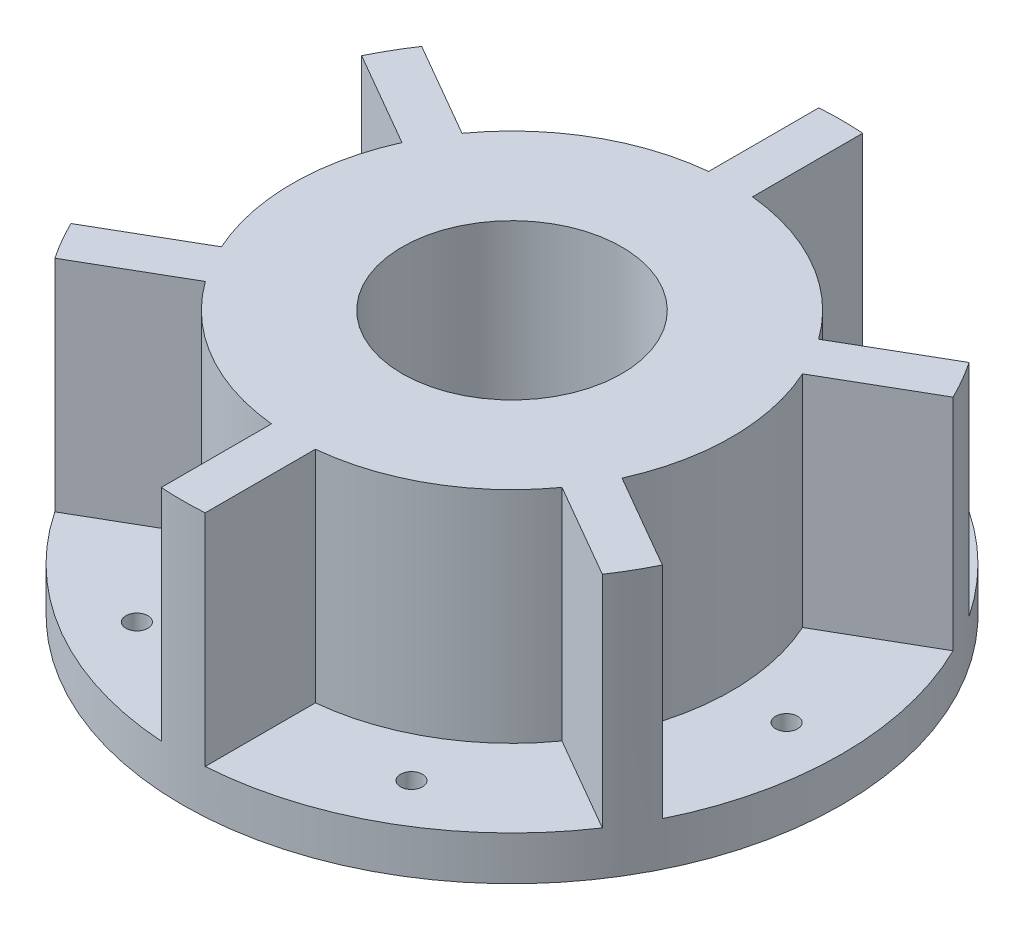
ISO-10303-21;
HEADER;
FILE_DESCRIPTION(('STEP AP214'),'2;1');
FILE_NAME('part.step','',(''),(''),'','','');
FILE_SCHEMA(('AUTOMOTIVE_DESIGN { 1 0 10303 214 1 1 1 1 }'));
ENDSEC;
DATA;
#1=APPLICATION_CONTEXT('core data for automotive mechanical design processes');
#2=APPLICATION_PROTOCOL_DEFINITION('international standard','automotive_design',2000,#1);
#3=PRODUCT_CONTEXT('',#1,'mechanical');
#4=PRODUCT('Part','Part','',(#3));
#5=PRODUCT_RELATED_PRODUCT_CATEGORY('part','',(#4));
#6=PRODUCT_DEFINITION_FORMATION('','',#4);
#7=PRODUCT_DEFINITION_CONTEXT('part definition',#1,'design');
#8=PRODUCT_DEFINITION('design','',#6,#7);
#9=PRODUCT_DEFINITION_SHAPE('','',#8);
#10=(LENGTH_UNIT() NAMED_UNIT(*) SI_UNIT(.MILLI.,.METRE.));
#11=(NAMED_UNIT(*) PLANE_ANGLE_UNIT() SI_UNIT($,.RADIAN.));
#12=(NAMED_UNIT(*) SI_UNIT($,.STERADIAN.) SOLID_ANGLE_UNIT());
#13=UNCERTAINTY_MEASURE_WITH_UNIT(LENGTH_MEASURE(1.E-05),#10,'distance_accuracy_value','');
#14=(GEOMETRIC_REPRESENTATION_CONTEXT(3) GLOBAL_UNCERTAINTY_ASSIGNED_CONTEXT((#13)) GLOBAL_UNIT_ASSIGNED_CONTEXT((#10,
#11,#12)) REPRESENTATION_CONTEXT('',''));
#15=CARTESIAN_POINT('',(0.,0.,0.));
#16=DIRECTION('',(0.,0.,1.));
#17=DIRECTION('',(1.,0.,0.));
#18=AXIS2_PLACEMENT_3D('',#15,#16,#17);
#19=CARTESIAN_POINT('',(0.,10.,0.));
#20=DIRECTION('',(0.,1.,0.));
#21=DIRECTION('',(0.,0.,1.));
#22=AXIS2_PLACEMENT_3D('',#19,#20,#21);
#23=PLANE('',#22);
#24=CARTESIAN_POINT('',(31.2500000000003,10.,54.1265877365273));
#25=DIRECTION('',(0.,1.,0.));
#26=DIRECTION('',(0.866025403784436,0.,-0.500000000000004));
#27=AXIS2_PLACEMENT_3D('',#24,#25,#26);
#28=CIRCLE('',#27,2.5);
#29=CARTESIAN_POINT('',(33.4150635094613,10.,52.8765877365273));
#30=VERTEX_POINT('',#29);
#31=EDGE_CURVE('E413',#30,#30,#28,.T.);
#32=ORIENTED_EDGE('',*,*,#31,.F.);
#33=EDGE_LOOP('',(#32));
#34=FACE_BOUND('',#33,.T.);
#35=CARTESIAN_POINT('',(0.,10.,0.));
#36=DIRECTION('',(0.,1.,0.));
#37=DIRECTION('',(0.,0.,1.));
#38=AXIS2_PLACEMENT_3D('',#35,#36,#37);
#39=CIRCLE('',#38,75.);
#40=CARTESIAN_POINT('',(5.00000000000001,10.,74.8331477354789));
#41=VERTEX_POINT('',#40);
#42=CARTESIAN_POINT('',(62.3074069840785,10.,41.7467008866619));
#43=VERTEX_POINT('',#42);
#44=EDGE_CURVE('E50',#41,#43,#39,.T.);
#45=ORIENTED_EDGE('',*,*,#44,.T.);
#46=DIRECTION('',(0.866025403784437,0.,0.500000000000004));
#47=VECTOR('',#46,1.);
#48=CARTESIAN_POINT('',(62.3074069840785,10.,41.7467008866619));
#49=LINE('',#48,#47);
#50=CARTESIAN_POINT('',(40.5842198490351,10.,29.2048129465879));
#51=VERTEX_POINT('',#50);
#52=EDGE_CURVE('E378',#51,#43,#49,.T.);
#53=ORIENTED_EDGE('',*,*,#52,.F.);
#54=CARTESIAN_POINT('',(0.,10.,0.));
#55=DIRECTION('',(0.,1.,0.));
#56=DIRECTION('',(0.,0.,1.));
#57=AXIS2_PLACEMENT_3D('',#54,#55,#56);
#58=CIRCLE('',#57,50.);
#59=CARTESIAN_POINT('',(5.,10.,49.749371855331));
#60=VERTEX_POINT('',#59);
#61=EDGE_CURVE('E223',#60,#51,#58,.T.);
#62=ORIENTED_EDGE('',*,*,#61,.F.);
#63=DIRECTION('',(0.,0.,-1.));
#64=VECTOR('',#63,1.);
#65=CARTESIAN_POINT('',(5.,10.,49.749371855331));
#66=LINE('',#65,#64);
#67=EDGE_CURVE('E283',#41,#60,#66,.T.);
#68=ORIENTED_EDGE('',*,*,#67,.F.);
#69=EDGE_LOOP('',(#45,#53,#62,#68));
#70=FACE_BOUND('',#69,.T.);
#71=ADVANCED_FACE('F42',(#34,#70),#23,.T.);
#72=CARTESIAN_POINT('',(62.5,10.,0.));
#73=DIRECTION('',(0.,1.,0.));
#74=DIRECTION('',(0.,0.,-1.));
#75=AXIS2_PLACEMENT_3D('',#72,#73,#74);
#76=CIRCLE('',#75,2.5);
#77=CARTESIAN_POINT('',(62.5,10.,-2.5));
#78=VERTEX_POINT('',#77);
#79=EDGE_CURVE('E407',#78,#78,#76,.T.);
#80=ORIENTED_EDGE('',*,*,#79,.F.);
#81=EDGE_LOOP('',(#80));
#82=FACE_BOUND('',#81,.T.);
#83=CARTESIAN_POINT('',(45.5842198490351,10.,20.5445589087435));
#84=VERTEX_POINT('',#83);
#85=CARTESIAN_POINT('',(45.5842198490353,10.,-20.5445589087432));
#86=VERTEX_POINT('',#85);
#87=EDGE_CURVE('E248',#84,#86,#58,.T.);
#88=ORIENTED_EDGE('',*,*,#87,.F.);
#89=DIRECTION('',(-0.866025403784437,0.,-0.500000000000004));
#90=VECTOR('',#89,1.);
#91=CARTESIAN_POINT('',(67.3074069840785,10.,33.0864468488175));
#92=LINE('',#91,#90);
#93=CARTESIAN_POINT('',(67.3074069840785,10.,33.0864468488175));
#94=VERTEX_POINT('',#93);
#95=EDGE_CURVE('E214',#94,#84,#92,.T.);
#96=ORIENTED_EDGE('',*,*,#95,.F.);
#97=CARTESIAN_POINT('',(67.3074069840787,10.,-33.0864468488171));
#98=VERTEX_POINT('',#97);
#99=EDGE_CURVE('E438',#94,#98,#39,.T.);
#100=ORIENTED_EDGE('',*,*,#99,.T.);
#101=DIRECTION('',(0.86602540378444,0.,-0.499999999999998));
#102=VECTOR('',#101,1.);
#103=CARTESIAN_POINT('',(67.3074069840787,10.,-33.0864468488171));
#104=LINE('',#103,#102);
#105=EDGE_CURVE('E346',#86,#98,#104,.T.);
#106=ORIENTED_EDGE('',*,*,#105,.F.);
#107=EDGE_LOOP('',(#88,#96,#100,#106));
#108=FACE_BOUND('',#107,.T.);
#109=ADVANCED_FACE('F430',(#82,#108),#23,.T.);
#110=CARTESIAN_POINT('',(0.,60.,0.));
#111=DIRECTION('',(0.,-1.,0.));
#112=DIRECTION('',(0.,0.,-1.));
#113=AXIS2_PLACEMENT_3D('',#110,#111,#112);
#114=CYLINDRICAL_SURFACE('',#113,50.);
#115=DIRECTION('',(0.,-1.,0.));
#116=VECTOR('',#115,1.);
#117=CARTESIAN_POINT('',(40.5842198490351,60.,29.2048129465879));
#118=LINE('',#117,#116);
#119=CARTESIAN_POINT('',(40.5842198490351,60.,29.2048129465879));
#120=VERTEX_POINT('',#119);
#121=EDGE_CURVE('E206',#120,#51,#118,.T.);
#122=ORIENTED_EDGE('',*,*,#121,.F.);
#123=CARTESIAN_POINT('',(0.,60.,0.));
#124=DIRECTION('',(0.,1.,0.));
#125=DIRECTION('',(0.,0.,1.));
#126=AXIS2_PLACEMENT_3D('',#123,#124,#125);
#127=CIRCLE('',#126,50.);
#128=CARTESIAN_POINT('',(5.,60.,49.749371855331));
#129=VERTEX_POINT('',#128);
#130=EDGE_CURVE('E221',#129,#120,#127,.T.);
#131=ORIENTED_EDGE('',*,*,#130,.F.);
#132=DIRECTION('',(0.,-1.,0.));
#133=VECTOR('',#132,1.);
#134=CARTESIAN_POINT('',(5.,60.,49.749371855331));
#135=LINE('',#134,#133);
#136=EDGE_CURVE('E269',#129,#60,#135,.T.);
#137=ORIENTED_EDGE('',*,*,#136,.T.);
#138=ORIENTED_EDGE('',*,*,#61,.T.);
#139=EDGE_LOOP('',(#122,#131,#137,#138));
#140=FACE_BOUND('',#139,.T.);
#141=ADVANCED_FACE('F219',(#140),#114,.T.);
#142=DIRECTION('',(0.,-1.,0.));
#143=VECTOR('',#142,1.);
#144=CARTESIAN_POINT('',(45.5842198490351,60.,20.5445589087435));
#145=LINE('',#144,#143);
#146=CARTESIAN_POINT('',(45.5842198490351,60.,20.5445589087435));
#147=VERTEX_POINT('',#146);
#148=EDGE_CURVE('E57',#147,#84,#145,.T.);
#149=ORIENTED_EDGE('',*,*,#148,.T.);
#150=ORIENTED_EDGE('',*,*,#87,.T.);
#151=DIRECTION('',(0.,-1.,0.));
#152=VECTOR('',#151,1.);
#153=CARTESIAN_POINT('',(45.5842198490353,60.,-20.5445589087432));
#154=LINE('',#153,#152);
#155=CARTESIAN_POINT('',(45.5842198490353,60.,-20.5445589087432));
#156=VERTEX_POINT('',#155);
#157=EDGE_CURVE('E326',#156,#86,#154,.T.);
#158=ORIENTED_EDGE('',*,*,#157,.F.);
#159=EDGE_CURVE('E232',#147,#156,#127,.T.);
#160=ORIENTED_EDGE('',*,*,#159,.F.);
#161=EDGE_LOOP('',(#149,#150,#158,#160));
#162=FACE_BOUND('',#161,.T.);
#163=ADVANCED_FACE('F497',(#162),#114,.T.);
#164=CARTESIAN_POINT('',(-62.5,10.,0.));
#165=DIRECTION('',(0.,1.,0.));
#166=DIRECTION('',(0.,0.,1.));
#167=AXIS2_PLACEMENT_3D('',#164,#165,#166);
#168=CIRCLE('',#167,2.5);
#169=CARTESIAN_POINT('',(-62.5,10.,2.5));
#170=VERTEX_POINT('',#169);
#171=EDGE_CURVE('E383',#170,#170,#168,.T.);
#172=ORIENTED_EDGE('',*,*,#171,.F.);
#173=EDGE_LOOP('',(#172));
#174=FACE_BOUND('',#173,.T.);
#175=CARTESIAN_POINT('',(-45.5842198490351,10.,-20.5445589087435));
#176=VERTEX_POINT('',#175);
#177=CARTESIAN_POINT('',(-45.5842198490353,10.,20.5445589087432));
#178=VERTEX_POINT('',#177);
#179=EDGE_CURVE('E251',#176,#178,#58,.T.);
#180=ORIENTED_EDGE('',*,*,#179,.F.);
#181=DIRECTION('',(0.866025403784437,0.,0.500000000000004));
#182=VECTOR('',#181,1.);
#183=CARTESIAN_POINT('',(-45.5842198490351,10.,-20.5445589087435));
#184=LINE('',#183,#182);
#185=CARTESIAN_POINT('',(-67.3074069840785,10.,-33.0864468488176));
#186=VERTEX_POINT('',#185);
#187=EDGE_CURVE('E224',#186,#176,#184,.T.);
#188=ORIENTED_EDGE('',*,*,#187,.F.);
#189=CARTESIAN_POINT('',(-67.3074069840787,10.,33.0864468488171));
#190=VERTEX_POINT('',#189);
#191=EDGE_CURVE('E441',#186,#190,#39,.T.);
#192=ORIENTED_EDGE('',*,*,#191,.T.);
#193=DIRECTION('',(-0.86602540378444,0.,0.499999999999998));
#194=VECTOR('',#193,1.);
#195=CARTESIAN_POINT('',(-45.5842198490353,10.,20.5445589087432));
#196=LINE('',#195,#194);
#197=EDGE_CURVE('E320',#178,#190,#196,.T.);
#198=ORIENTED_EDGE('',*,*,#197,.F.);
#199=EDGE_LOOP('',(#180,#188,#192,#198));
#200=FACE_BOUND('',#199,.T.);
#201=ADVANCED_FACE('F472',(#174,#200),#23,.T.);
#202=CARTESIAN_POINT('',(-31.2500000000006,10.,-54.126587736527));
#203=DIRECTION('',(0.,1.,0.));
#204=DIRECTION('',(-0.866025403784433,0.,0.50000000000001));
#205=AXIS2_PLACEMENT_3D('',#202,#203,#204);
#206=CIRCLE('',#205,2.5);
#207=CARTESIAN_POINT('',(-33.4150635094617,10.,-52.876587736527));
#208=VERTEX_POINT('',#207);
#209=EDGE_CURVE('E395',#208,#208,#206,.T.);
#210=ORIENTED_EDGE('',*,*,#209,.F.);
#211=EDGE_LOOP('',(#210));
#212=FACE_BOUND('',#211,.T.);
#213=CARTESIAN_POINT('',(-5.00000000000001,10.,-74.8331477354789));
#214=VERTEX_POINT('',#213);
#215=CARTESIAN_POINT('',(-62.3074069840785,10.,-41.7467008866619));
#216=VERTEX_POINT('',#215);
#217=EDGE_CURVE('E439',#214,#216,#39,.T.);
#218=ORIENTED_EDGE('',*,*,#217,.T.);
#219=DIRECTION('',(-0.866025403784437,0.,-0.500000000000004));
#220=VECTOR('',#219,1.);
#221=CARTESIAN_POINT('',(-40.5842198490351,10.,-29.2048129465879));
#222=LINE('',#221,#220);
#223=CARTESIAN_POINT('',(-40.5842198490351,10.,-29.2048129465879));
#224=VERTEX_POINT('',#223);
#225=EDGE_CURVE('E363',#224,#216,#222,.T.);
#226=ORIENTED_EDGE('',*,*,#225,.F.);
#227=CARTESIAN_POINT('',(-5.00000000000001,10.,-49.749371855331));
#228=VERTEX_POINT('',#227);
#229=EDGE_CURVE('E249',#228,#224,#58,.T.);
#230=ORIENTED_EDGE('',*,*,#229,.F.);
#231=DIRECTION('',(0.,0.,1.));
#232=VECTOR('',#231,1.);
#233=CARTESIAN_POINT('',(-5.00000000000001,10.,-74.8331477354789));
#234=LINE('',#233,#232);
#235=EDGE_CURVE('E291',#214,#228,#234,.T.);
#236=ORIENTED_EDGE('',*,*,#235,.F.);
#237=EDGE_LOOP('',(#218,#226,#230,#236));
#238=FACE_BOUND('',#237,.T.);
#239=ADVANCED_FACE('F483',(#212,#238),#23,.T.);
#240=DIRECTION('',(0.,-1.,0.));
#241=VECTOR('',#240,1.);
#242=CARTESIAN_POINT('',(-45.5842198490351,60.,-20.5445589087435));
#243=LINE('',#242,#241);
#244=CARTESIAN_POINT('',(-45.5842198490351,60.,-20.5445589087435));
#245=VERTEX_POINT('',#244);
#246=EDGE_CURVE('E65',#245,#176,#243,.T.);
#247=ORIENTED_EDGE('',*,*,#246,.T.);
#248=ORIENTED_EDGE('',*,*,#179,.T.);
#249=DIRECTION('',(0.,-1.,0.));
#250=VECTOR('',#249,1.);
#251=CARTESIAN_POINT('',(-45.5842198490353,60.,20.5445589087432));
#252=LINE('',#251,#250);
#253=CARTESIAN_POINT('',(-45.5842198490353,60.,20.5445589087432));
#254=VERTEX_POINT('',#253);
#255=EDGE_CURVE('E313',#254,#178,#252,.T.);
#256=ORIENTED_EDGE('',*,*,#255,.F.);
#257=EDGE_CURVE('E238',#245,#254,#127,.T.);
#258=ORIENTED_EDGE('',*,*,#257,.F.);
#259=EDGE_LOOP('',(#247,#248,#256,#258));
#260=FACE_BOUND('',#259,.T.);
#261=ADVANCED_FACE('F477',(#260),#114,.T.);
#262=DIRECTION('',(0.,-1.,0.));
#263=VECTOR('',#262,1.);
#264=CARTESIAN_POINT('',(-40.5842198490351,60.,-29.2048129465879));
#265=LINE('',#264,#263);
#266=CARTESIAN_POINT('',(-40.5842198490351,60.,-29.2048129465879));
#267=VERTEX_POINT('',#266);
#268=EDGE_CURVE('E357',#267,#224,#265,.T.);
#269=ORIENTED_EDGE('',*,*,#268,.F.);
#270=CARTESIAN_POINT('',(-5.00000000000001,60.,-49.749371855331));
#271=VERTEX_POINT('',#270);
#272=EDGE_CURVE('E234',#271,#267,#127,.T.);
#273=ORIENTED_EDGE('',*,*,#272,.F.);
#274=DIRECTION('',(0.,-1.,0.));
#275=VECTOR('',#274,1.);
#276=CARTESIAN_POINT('',(-5.00000000000001,60.,-49.749371855331));
#277=LINE('',#276,#275);
#278=EDGE_CURVE('E296',#271,#228,#277,.T.);
#279=ORIENTED_EDGE('',*,*,#278,.T.);
#280=ORIENTED_EDGE('',*,*,#229,.T.);
#281=EDGE_LOOP('',(#269,#273,#279,#280));
#282=FACE_BOUND('',#281,.T.);
#283=ADVANCED_FACE('F487',(#282),#114,.T.);
#284=CARTESIAN_POINT('',(31.2499999999995,10.,-54.1265877365277));
#285=DIRECTION('',(0.,1.,0.));
#286=DIRECTION('',(-0.866025403784443,0.,-0.499999999999992));
#287=AXIS2_PLACEMENT_3D('',#284,#285,#286);
#288=CIRCLE('',#287,2.5);
#289=CARTESIAN_POINT('',(29.0849364905384,10.,-55.3765877365277));
#290=VERTEX_POINT('',#289);
#291=EDGE_CURVE('E401',#290,#290,#288,.T.);
#292=ORIENTED_EDGE('',*,*,#291,.F.);
#293=EDGE_LOOP('',(#292));
#294=FACE_BOUND('',#293,.T.);
#295=CARTESIAN_POINT('',(40.5842198490353,10.,-29.2048129465876));
#296=VERTEX_POINT('',#295);
#297=CARTESIAN_POINT('',(4.99999999999999,10.,-49.749371855331));
#298=VERTEX_POINT('',#297);
#299=EDGE_CURVE('E250',#296,#298,#58,.T.);
#300=ORIENTED_EDGE('',*,*,#299,.F.);
#301=DIRECTION('',(-0.86602540378444,0.,0.499999999999998));
#302=VECTOR('',#301,1.);
#303=CARTESIAN_POINT('',(62.3074069840787,10.,-41.7467008866615));
#304=LINE('',#303,#302);
#305=CARTESIAN_POINT('',(62.3074069840787,10.,-41.7467008866615));
#306=VERTEX_POINT('',#305);
#307=EDGE_CURVE('E343',#306,#296,#304,.T.);
#308=ORIENTED_EDGE('',*,*,#307,.F.);
#309=CARTESIAN_POINT('',(4.99999999999999,10.,-74.8331477354789));
#310=VERTEX_POINT('',#309);
#311=EDGE_CURVE('E440',#306,#310,#39,.T.);
#312=ORIENTED_EDGE('',*,*,#311,.T.);
#313=DIRECTION('',(0.,0.,-1.));
#314=VECTOR('',#313,1.);
#315=CARTESIAN_POINT('',(4.99999999999999,10.,-74.8331477354789));
#316=LINE('',#315,#314);
#317=EDGE_CURVE('E285',#298,#310,#316,.T.);
#318=ORIENTED_EDGE('',*,*,#317,.F.);
#319=EDGE_LOOP('',(#300,#308,#312,#318));
#320=FACE_BOUND('',#319,.T.);
#321=ADVANCED_FACE('F489',(#294,#320),#23,.T.);
#322=DIRECTION('',(0.,-1.,0.));
#323=VECTOR('',#322,1.);
#324=CARTESIAN_POINT('',(40.5842198490353,60.,-29.2048129465876));
#325=LINE('',#324,#323);
#326=CARTESIAN_POINT('',(40.5842198490353,60.,-29.2048129465876));
#327=VERTEX_POINT('',#326);
#328=EDGE_CURVE('E339',#327,#296,#325,.T.);
#329=ORIENTED_EDGE('',*,*,#328,.T.);
#330=ORIENTED_EDGE('',*,*,#299,.T.);
#331=DIRECTION('',(0.,-1.,0.));
#332=VECTOR('',#331,1.);
#333=CARTESIAN_POINT('',(4.99999999999999,60.,-49.749371855331));
#334=LINE('',#333,#332);
#335=CARTESIAN_POINT('',(4.99999999999999,60.,-49.749371855331));
#336=VERTEX_POINT('',#335);
#337=EDGE_CURVE('E306',#336,#298,#334,.T.);
#338=ORIENTED_EDGE('',*,*,#337,.F.);
#339=EDGE_CURVE('E237',#327,#336,#127,.T.);
#340=ORIENTED_EDGE('',*,*,#339,.F.);
#341=EDGE_LOOP('',(#329,#330,#338,#340));
#342=FACE_BOUND('',#341,.T.);
#343=ADVANCED_FACE('F491',(#342),#114,.T.);
#344=CARTESIAN_POINT('',(-31.2499999999999,10.,54.1265877365275));
#345=DIRECTION('',(0.,1.,0.));
#346=DIRECTION('',(0.86602540378444,0.,0.499999999999998));
#347=AXIS2_PLACEMENT_3D('',#344,#345,#346);
#348=CIRCLE('',#347,2.5);
#349=CARTESIAN_POINT('',(-29.0849364905388,10.,55.3765877365275));
#350=VERTEX_POINT('',#349);
#351=EDGE_CURVE('E389',#350,#350,#348,.T.);
#352=ORIENTED_EDGE('',*,*,#351,.F.);
#353=EDGE_LOOP('',(#352));
#354=FACE_BOUND('',#353,.T.);
#355=CARTESIAN_POINT('',(-40.5842198490353,10.,29.2048129465876));
#356=VERTEX_POINT('',#355);
#357=CARTESIAN_POINT('',(-5.00000000000001,10.,49.749371855331));
#358=VERTEX_POINT('',#357);
#359=EDGE_CURVE('E254',#356,#358,#58,.T.);
#360=ORIENTED_EDGE('',*,*,#359,.F.);
#361=DIRECTION('',(0.86602540378444,0.,-0.499999999999998));
#362=VECTOR('',#361,1.);
#363=CARTESIAN_POINT('',(-40.5842198490353,10.,29.2048129465876));
#364=LINE('',#363,#362);
#365=CARTESIAN_POINT('',(-62.3074069840787,10.,41.7467008866615));
#366=VERTEX_POINT('',#365);
#367=EDGE_CURVE('E324',#366,#356,#364,.T.);
#368=ORIENTED_EDGE('',*,*,#367,.F.);
#369=CARTESIAN_POINT('',(-4.99999999999999,10.,74.8331477354789));
#370=VERTEX_POINT('',#369);
#371=EDGE_CURVE('E236',#366,#370,#39,.T.);
#372=ORIENTED_EDGE('',*,*,#371,.T.);
#373=DIRECTION('',(0.,0.,1.));
#374=VECTOR('',#373,1.);
#375=CARTESIAN_POINT('',(-5.,10.,49.749371855331));
#376=LINE('',#375,#374);
#377=EDGE_CURVE('E279',#358,#370,#376,.T.);
#378=ORIENTED_EDGE('',*,*,#377,.F.);
#379=EDGE_LOOP('',(#360,#368,#372,#378));
#380=FACE_BOUND('',#379,.T.);
#381=ADVANCED_FACE('F451',(#354,#380),#23,.T.);
#382=DIRECTION('',(0.,-1.,0.));
#383=VECTOR('',#382,1.);
#384=CARTESIAN_POINT('',(-40.5842198490353,60.,29.2048129465876));
#385=LINE('',#384,#383);
#386=CARTESIAN_POINT('',(-40.5842198490353,60.,29.2048129465876));
#387=VERTEX_POINT('',#386);
#388=EDGE_CURVE('E311',#387,#356,#385,.T.);
#389=ORIENTED_EDGE('',*,*,#388,.T.);
#390=ORIENTED_EDGE('',*,*,#359,.T.);
#391=DIRECTION('',(0.,-1.,0.));
#392=VECTOR('',#391,1.);
#393=CARTESIAN_POINT('',(-5.00000000000001,60.,49.749371855331));
#394=LINE('',#393,#392);
#395=CARTESIAN_POINT('',(-5.00000000000001,60.,49.749371855331));
#396=VERTEX_POINT('',#395);
#397=EDGE_CURVE('E273',#396,#358,#394,.T.);
#398=ORIENTED_EDGE('',*,*,#397,.F.);
#399=EDGE_CURVE('E242',#387,#396,#127,.T.);
#400=ORIENTED_EDGE('',*,*,#399,.F.);
#401=EDGE_LOOP('',(#389,#390,#398,#400));
#402=FACE_BOUND('',#401,.T.);
#403=ADVANCED_FACE('F458',(#402),#114,.T.);
#404=CARTESIAN_POINT('',(0.,10.,0.));
#405=DIRECTION('',(0.,-1.,0.));
#406=DIRECTION('',(0.,0.,-1.));
#407=AXIS2_PLACEMENT_3D('',#404,#405,#406);
#408=CYLINDRICAL_SURFACE('',#407,75.);
#409=DIRECTION('',(0.,-1.,0.));
#410=VECTOR('',#409,1.);
#411=CARTESIAN_POINT('',(-4.99999999999999,60.,74.8331477354789));
#412=LINE('',#411,#410);
#413=CARTESIAN_POINT('',(-4.99999999999999,60.,74.8331477354789));
#414=VERTEX_POINT('',#413);
#415=EDGE_CURVE('E275',#414,#370,#412,.T.);
#416=ORIENTED_EDGE('',*,*,#415,.T.);
#417=ORIENTED_EDGE('',*,*,#371,.F.);
#418=DIRECTION('',(0.,-1.,0.));
#419=VECTOR('',#418,1.);
#420=CARTESIAN_POINT('',(-62.3074069840787,60.,41.7467008866615));
#421=LINE('',#420,#419);
#422=CARTESIAN_POINT('',(-62.3074069840787,60.,41.7467008866615));
#423=VERTEX_POINT('',#422);
#424=EDGE_CURVE('E309',#423,#366,#421,.T.);
#425=ORIENTED_EDGE('',*,*,#424,.F.);
#426=CARTESIAN_POINT('',(0.,60.,0.));
#427=DIRECTION('',(0.,1.,0.));
#428=DIRECTION('',(-0.86602540378444,0.,0.499999999999998));
#429=AXIS2_PLACEMENT_3D('',#426,#427,#428);
#430=CIRCLE('',#429,75.);
#431=CARTESIAN_POINT('',(-67.3074069840787,60.,33.0864468488171));
#432=VERTEX_POINT('',#431);
#433=EDGE_CURVE('E323',#432,#423,#430,.T.);
#434=ORIENTED_EDGE('',*,*,#433,.F.);
#435=DIRECTION('',(0.,-1.,0.));
#436=VECTOR('',#435,1.);
#437=CARTESIAN_POINT('',(-67.3074069840787,60.,33.0864468488171));
#438=LINE('',#437,#436);
#439=EDGE_CURVE('E316',#432,#190,#438,.T.);
#440=ORIENTED_EDGE('',*,*,#439,.T.);
#441=ORIENTED_EDGE('',*,*,#191,.F.);
#442=DIRECTION('',(0.,-1.,0.));
#443=VECTOR('',#442,1.);
#444=CARTESIAN_POINT('',(-67.3074069840785,60.,-33.0864468488176));
#445=LINE('',#444,#443);
#446=CARTESIAN_POINT('',(-67.3074069840785,60.,-33.0864468488176));
#447=VERTEX_POINT('',#446);
#448=EDGE_CURVE('E349',#447,#186,#445,.T.);
#449=ORIENTED_EDGE('',*,*,#448,.F.);
#450=CARTESIAN_POINT('',(0.,60.,0.));
#451=DIRECTION('',(0.,1.,0.));
#452=DIRECTION('',(-0.866025403784436,0.,-0.500000000000004));
#453=AXIS2_PLACEMENT_3D('',#450,#451,#452);
#454=CIRCLE('',#453,75.);
#455=CARTESIAN_POINT('',(-62.3074069840785,60.,-41.7467008866619));
#456=VERTEX_POINT('',#455);
#457=EDGE_CURVE('E365',#456,#447,#454,.T.);
#458=ORIENTED_EDGE('',*,*,#457,.F.);
#459=DIRECTION('',(0.,-1.,0.));
#460=VECTOR('',#459,1.);
#461=CARTESIAN_POINT('',(-62.3074069840785,60.,-41.7467008866619));
#462=LINE('',#461,#460);
#463=EDGE_CURVE('E359',#456,#216,#462,.T.);
#464=ORIENTED_EDGE('',*,*,#463,.T.);
#465=ORIENTED_EDGE('',*,*,#217,.F.);
#466=DIRECTION('',(0.,-1.,0.));
#467=VECTOR('',#466,1.);
#468=CARTESIAN_POINT('',(-5.00000000000001,60.,-74.8331477354789));
#469=LINE('',#468,#467);
#470=CARTESIAN_POINT('',(-5.00000000000001,60.,-74.8331477354789));
#471=VERTEX_POINT('',#470);
#472=EDGE_CURVE('E301',#471,#214,#469,.T.);
#473=ORIENTED_EDGE('',*,*,#472,.F.);
#474=CARTESIAN_POINT('',(0.,60.,0.));
#475=DIRECTION('',(0.,1.,0.));
#476=DIRECTION('',(0.,0.,1.));
#477=AXIS2_PLACEMENT_3D('',#474,#475,#476);
#478=CIRCLE('',#477,75.);
#479=CARTESIAN_POINT('',(4.99999999999999,60.,-74.8331477354789));
#480=VERTEX_POINT('',#479);
#481=EDGE_CURVE('E292',#480,#471,#478,.T.);
#482=ORIENTED_EDGE('',*,*,#481,.F.);
#483=DIRECTION('',(0.,-1.,0.));
#484=VECTOR('',#483,1.);
#485=CARTESIAN_POINT('',(4.99999999999999,60.,-74.8331477354789));
#486=LINE('',#485,#484);
#487=EDGE_CURVE('E303',#480,#310,#486,.T.);
#488=ORIENTED_EDGE('',*,*,#487,.T.);
#489=ORIENTED_EDGE('',*,*,#311,.F.);
#490=DIRECTION('',(0.,-1.,0.));
#491=VECTOR('',#490,1.);
#492=CARTESIAN_POINT('',(62.3074069840787,60.,-41.7467008866615));
#493=LINE('',#492,#491);
#494=CARTESIAN_POINT('',(62.3074069840787,60.,-41.7467008866615));
#495=VERTEX_POINT('',#494);
#496=EDGE_CURVE('E337',#495,#306,#493,.T.);
#497=ORIENTED_EDGE('',*,*,#496,.F.);
#498=CARTESIAN_POINT('',(0.,60.,0.));
#499=DIRECTION('',(0.,1.,0.));
#500=DIRECTION('',(-0.86602540378444,0.,0.499999999999998));
#501=AXIS2_PLACEMENT_3D('',#498,#499,#500);
#502=CIRCLE('',#501,75.);
#503=CARTESIAN_POINT('',(67.3074069840787,60.,-33.0864468488171));
#504=VERTEX_POINT('',#503);
#505=EDGE_CURVE('E352',#504,#495,#502,.T.);
#506=ORIENTED_EDGE('',*,*,#505,.F.);
#507=DIRECTION('',(0.,-1.,0.));
#508=VECTOR('',#507,1.);
#509=CARTESIAN_POINT('',(67.3074069840787,60.,-33.0864468488171));
#510=LINE('',#509,#508);
#511=EDGE_CURVE('E334',#504,#98,#510,.T.);
#512=ORIENTED_EDGE('',*,*,#511,.T.);
#513=ORIENTED_EDGE('',*,*,#99,.F.);
#514=DIRECTION('',(0.,-1.,0.));
#515=VECTOR('',#514,1.);
#516=CARTESIAN_POINT('',(67.3074069840785,60.,33.0864468488175));
#517=LINE('',#516,#515);
#518=CARTESIAN_POINT('',(67.3074069840785,60.,33.0864468488175));
#519=VERTEX_POINT('',#518);
#520=EDGE_CURVE('E373',#519,#94,#517,.T.);
#521=ORIENTED_EDGE('',*,*,#520,.F.);
#522=CARTESIAN_POINT('',(0.,60.,0.));
#523=DIRECTION('',(0.,1.,0.));
#524=DIRECTION('',(-0.866025403784436,0.,-0.500000000000004));
#525=AXIS2_PLACEMENT_3D('',#522,#523,#524);
#526=CIRCLE('',#525,75.);
#527=CARTESIAN_POINT('',(62.3074069840785,60.,41.7467008866619));
#528=VERTEX_POINT('',#527);
#529=EDGE_CURVE('E213',#528,#519,#526,.T.);
#530=ORIENTED_EDGE('',*,*,#529,.F.);
#531=DIRECTION('',(0.,-1.,0.));
#532=VECTOR('',#531,1.);
#533=CARTESIAN_POINT('',(62.3074069840785,60.,41.7467008866619));
#534=LINE('',#533,#532);
#535=EDGE_CURVE('E209',#528,#43,#534,.T.);
#536=ORIENTED_EDGE('',*,*,#535,.T.);
#537=ORIENTED_EDGE('',*,*,#44,.F.);
#538=DIRECTION('',(0.,-1.,0.));
#539=VECTOR('',#538,1.);
#540=CARTESIAN_POINT('',(5.00000000000001,60.,74.8331477354789));
#541=LINE('',#540,#539);
#542=CARTESIAN_POINT('',(5.00000000000001,60.,74.8331477354789));
#543=VERTEX_POINT('',#542);
#544=EDGE_CURVE('E266',#543,#41,#541,.T.);
#545=ORIENTED_EDGE('',*,*,#544,.F.);
#546=CARTESIAN_POINT('',(0.,60.,0.));
#547=DIRECTION('',(0.,1.,0.));
#548=DIRECTION('',(0.,0.,1.));
#549=AXIS2_PLACEMENT_3D('',#546,#547,#548);
#550=CIRCLE('',#549,75.);
#551=EDGE_CURVE('E282',#414,#543,#550,.T.);
#552=ORIENTED_EDGE('',*,*,#551,.F.);
#553=EDGE_LOOP('',(#416,#417,#425,#434,#440,#441,#449,#458,#464,#465,#473,#482,#488,#489,#497,
#506,#512,#513,#521,#530,#536,#537,#545,#552));
#554=FACE_BOUND('',#553,.T.);
#555=CARTESIAN_POINT('',(0.,0.,0.));
#556=DIRECTION('',(0.,1.,0.));
#557=DIRECTION('',(0.,0.,1.));
#558=AXIS2_PLACEMENT_3D('',#555,#556,#557);
#559=CIRCLE('',#558,75.);
#560=CARTESIAN_POINT('',(0.,0.,75.));
#561=VERTEX_POINT('',#560);
#562=EDGE_CURVE('E231',#561,#561,#559,.T.);
#563=ORIENTED_EDGE('',*,*,#562,.T.);
#564=EDGE_LOOP('',(#563));
#565=FACE_BOUND('',#564,.T.);
#566=ADVANCED_FACE('F44',(#554,#565),#408,.T.);
#567=CARTESIAN_POINT('',(0.,0.,0.));
#568=DIRECTION('',(0.,1.,0.));
#569=DIRECTION('',(0.,0.,1.));
#570=AXIS2_PLACEMENT_3D('',#567,#568,#569);
#571=PLANE('',#570);
#572=ORIENTED_EDGE('',*,*,#562,.F.);
#573=EDGE_LOOP('',(#572));
#574=FACE_BOUND('',#573,.T.);
#575=ADVANCED_FACE('F509',(#574),#571,.F.);
#576=CARTESIAN_POINT('',(0.,60.,0.));
#577=DIRECTION('',(0.,1.,0.));
#578=DIRECTION('',(0.,0.,1.));
#579=AXIS2_PLACEMENT_3D('',#576,#577,#578);
#580=PLANE('',#579);
#581=DIRECTION('',(0.,0.,-1.));
#582=VECTOR('',#581,1.);
#583=CARTESIAN_POINT('',(5.,60.,49.749371855331));
#584=LINE('',#583,#582);
#585=EDGE_CURVE('E230',#543,#129,#584,.T.);
#586=ORIENTED_EDGE('',*,*,#585,.T.);
#587=ORIENTED_EDGE('',*,*,#130,.T.);
#588=DIRECTION('',(0.866025403784437,0.,0.500000000000004));
#589=VECTOR('',#588,1.);
#590=CARTESIAN_POINT('',(62.3074069840785,60.,41.7467008866619));
#591=LINE('',#590,#589);
#592=EDGE_CURVE('E203',#120,#528,#591,.T.);
#593=ORIENTED_EDGE('',*,*,#592,.T.);
#594=ORIENTED_EDGE('',*,*,#529,.T.);
#595=DIRECTION('',(-0.866025403784437,0.,-0.500000000000004));
#596=VECTOR('',#595,1.);
#597=CARTESIAN_POINT('',(67.3074069840785,60.,33.0864468488175));
#598=LINE('',#597,#596);
#599=EDGE_CURVE('E376',#519,#147,#598,.T.);
#600=ORIENTED_EDGE('',*,*,#599,.T.);
#601=ORIENTED_EDGE('',*,*,#159,.T.);
#602=DIRECTION('',(0.86602540378444,0.,-0.499999999999998));
#603=VECTOR('',#602,1.);
#604=CARTESIAN_POINT('',(67.3074069840787,60.,-33.0864468488171));
#605=LINE('',#604,#603);
#606=EDGE_CURVE('E345',#156,#504,#605,.T.);
#607=ORIENTED_EDGE('',*,*,#606,.T.);
#608=ORIENTED_EDGE('',*,*,#505,.T.);
#609=DIRECTION('',(-0.86602540378444,0.,0.499999999999998));
#610=VECTOR('',#609,1.);
#611=CARTESIAN_POINT('',(62.3074069840787,60.,-41.7467008866615));
#612=LINE('',#611,#610);
#613=EDGE_CURVE('E342',#495,#327,#612,.T.);
#614=ORIENTED_EDGE('',*,*,#613,.T.);
#615=ORIENTED_EDGE('',*,*,#339,.T.);
#616=DIRECTION('',(0.,0.,-1.));
#617=VECTOR('',#616,1.);
#618=CARTESIAN_POINT('',(4.99999999999999,60.,-74.8331477354789));
#619=LINE('',#618,#617);
#620=EDGE_CURVE('E289',#336,#480,#619,.T.);
#621=ORIENTED_EDGE('',*,*,#620,.T.);
#622=ORIENTED_EDGE('',*,*,#481,.T.);
#623=DIRECTION('',(0.,0.,1.));
#624=VECTOR('',#623,1.);
#625=CARTESIAN_POINT('',(-5.00000000000001,60.,-74.8331477354789));
#626=LINE('',#625,#624);
#627=EDGE_CURVE('E294',#471,#271,#626,.T.);
#628=ORIENTED_EDGE('',*,*,#627,.T.);
#629=ORIENTED_EDGE('',*,*,#272,.T.);
#630=DIRECTION('',(-0.866025403784437,0.,-0.500000000000004));
#631=VECTOR('',#630,1.);
#632=CARTESIAN_POINT('',(-40.5842198490351,60.,-29.2048129465879));
#633=LINE('',#632,#631);
#634=EDGE_CURVE('E362',#267,#456,#633,.T.);
#635=ORIENTED_EDGE('',*,*,#634,.T.);
#636=ORIENTED_EDGE('',*,*,#457,.T.);
#637=DIRECTION('',(0.866025403784437,0.,0.500000000000004));
#638=VECTOR('',#637,1.);
#639=CARTESIAN_POINT('',(-45.5842198490351,60.,-20.5445589087435));
#640=LINE('',#639,#638);
#641=EDGE_CURVE('E368',#447,#245,#640,.T.);
#642=ORIENTED_EDGE('',*,*,#641,.T.);
#643=ORIENTED_EDGE('',*,*,#257,.T.);
#644=DIRECTION('',(-0.86602540378444,0.,0.499999999999998));
#645=VECTOR('',#644,1.);
#646=CARTESIAN_POINT('',(-45.5842198490353,60.,20.5445589087432));
#647=LINE('',#646,#645);
#648=EDGE_CURVE('E319',#254,#432,#647,.T.);
#649=ORIENTED_EDGE('',*,*,#648,.T.);
#650=ORIENTED_EDGE('',*,*,#433,.T.);
#651=DIRECTION('',(0.86602540378444,0.,-0.499999999999998));
#652=VECTOR('',#651,1.);
#653=CARTESIAN_POINT('',(-40.5842198490353,60.,29.2048129465876));
#654=LINE('',#653,#652);
#655=EDGE_CURVE('E328',#423,#387,#654,.T.);
#656=ORIENTED_EDGE('',*,*,#655,.T.);
#657=ORIENTED_EDGE('',*,*,#399,.T.);
#658=DIRECTION('',(0.,0.,1.));
#659=VECTOR('',#658,1.);
#660=CARTESIAN_POINT('',(-5.,60.,49.749371855331));
#661=LINE('',#660,#659);
#662=EDGE_CURVE('E278',#396,#414,#661,.T.);
#663=ORIENTED_EDGE('',*,*,#662,.T.);
#664=ORIENTED_EDGE('',*,*,#551,.T.);
#665=EDGE_LOOP('',(#586,#587,#593,#594,#600,#601,#607,#608,#614,#615,#621,#622,#628,#629,#635,
#636,#642,#643,#649,#650,#656,#657,#663,#664));
#666=FACE_BOUND('',#665,.T.);
#667=CARTESIAN_POINT('',(0.,60.,0.));
#668=DIRECTION('',(0.,1.,0.));
#669=DIRECTION('',(0.,0.,1.));
#670=AXIS2_PLACEMENT_3D('',#667,#668,#669);
#671=CIRCLE('',#670,25.);
#672=CARTESIAN_POINT('',(0.,60.,25.));
#673=VERTEX_POINT('',#672);
#674=EDGE_CURVE('E259',#673,#673,#671,.T.);
#675=ORIENTED_EDGE('',*,*,#674,.F.);
#676=EDGE_LOOP('',(#675));
#677=FACE_BOUND('',#676,.T.);
#678=ADVANCED_FACE('F227',(#666,#677),#580,.T.);
#679=CARTESIAN_POINT('',(0.,60.,0.));
#680=DIRECTION('',(0.,-1.,0.));
#681=DIRECTION('',(0.,0.,-1.));
#682=AXIS2_PLACEMENT_3D('',#679,#680,#681);
#683=CYLINDRICAL_SURFACE('',#682,25.);
#684=ORIENTED_EDGE('',*,*,#674,.T.);
#685=EDGE_LOOP('',(#684));
#686=FACE_BOUND('',#685,.T.);
#687=CARTESIAN_POINT('',(0.,10.,0.));
#688=DIRECTION('',(0.,1.,0.));
#689=DIRECTION('',(0.,0.,1.));
#690=AXIS2_PLACEMENT_3D('',#687,#688,#689);
#691=CIRCLE('',#690,25.);
#692=CARTESIAN_POINT('',(0.,10.,25.));
#693=VERTEX_POINT('',#692);
#694=EDGE_CURVE('E11',#693,#693,#691,.F.);
#695=ORIENTED_EDGE('',*,*,#694,.T.);
#696=EDGE_LOOP('',(#695));
#697=FACE_BOUND('',#696,.T.);
#698=ADVANCED_FACE('F576',(#686,#697),#683,.F.);
#699=ORIENTED_EDGE('',*,*,#694,.F.);
#700=EDGE_LOOP('',(#699));
#701=FACE_BOUND('',#700,.T.);
#702=ADVANCED_FACE('F432',(#701),#23,.T.);
#703=CARTESIAN_POINT('',(5.,60.,49.749371855331));
#704=DIRECTION('',(-1.,0.,0.));
#705=DIRECTION('',(0.,0.,1.));
#706=AXIS2_PLACEMENT_3D('',#703,#704,#705);
#707=PLANE('',#706);
#708=ORIENTED_EDGE('',*,*,#67,.T.);
#709=ORIENTED_EDGE('',*,*,#136,.F.);
#710=ORIENTED_EDGE('',*,*,#585,.F.);
#711=ORIENTED_EDGE('',*,*,#544,.T.);
#712=EDGE_LOOP('',(#708,#709,#710,#711));
#713=FACE_BOUND('',#712,.T.);
#714=ADVANCED_FACE('F572',(#713),#707,.F.);
#715=CARTESIAN_POINT('',(-5.,60.,49.749371855331));
#716=DIRECTION('',(1.,0.,0.));
#717=DIRECTION('',(0.,0.,-1.));
#718=AXIS2_PLACEMENT_3D('',#715,#716,#717);
#719=PLANE('',#718);
#720=ORIENTED_EDGE('',*,*,#377,.T.);
#721=ORIENTED_EDGE('',*,*,#415,.F.);
#722=ORIENTED_EDGE('',*,*,#662,.F.);
#723=ORIENTED_EDGE('',*,*,#397,.T.);
#724=EDGE_LOOP('',(#720,#721,#722,#723));
#725=FACE_BOUND('',#724,.T.);
#726=ADVANCED_FACE('F455',(#725),#719,.F.);
#727=CARTESIAN_POINT('',(4.99999999999999,60.,-74.8331477354789));
#728=DIRECTION('',(-1.,0.,0.));
#729=DIRECTION('',(0.,0.,1.));
#730=AXIS2_PLACEMENT_3D('',#727,#728,#729);
#731=PLANE('',#730);
#732=ORIENTED_EDGE('',*,*,#317,.T.);
#733=ORIENTED_EDGE('',*,*,#487,.F.);
#734=ORIENTED_EDGE('',*,*,#620,.F.);
#735=ORIENTED_EDGE('',*,*,#337,.T.);
#736=EDGE_LOOP('',(#732,#733,#734,#735));
#737=FACE_BOUND('',#736,.T.);
#738=ADVANCED_FACE('F564',(#737),#731,.F.);
#739=CARTESIAN_POINT('',(-5.00000000000001,60.,-74.8331477354789));
#740=DIRECTION('',(1.,0.,0.));
#741=DIRECTION('',(0.,0.,-1.));
#742=AXIS2_PLACEMENT_3D('',#739,#740,#741);
#743=PLANE('',#742);
#744=ORIENTED_EDGE('',*,*,#235,.T.);
#745=ORIENTED_EDGE('',*,*,#278,.F.);
#746=ORIENTED_EDGE('',*,*,#627,.F.);
#747=ORIENTED_EDGE('',*,*,#472,.T.);
#748=EDGE_LOOP('',(#744,#745,#746,#747));
#749=FACE_BOUND('',#748,.T.);
#750=ADVANCED_FACE('F485',(#749),#743,.F.);
#751=CARTESIAN_POINT('',(-40.5842198490353,60.,29.2048129465876));
#752=DIRECTION('',(-0.499999999999998,0.,-0.86602540378444));
#753=DIRECTION('',(-0.86602540378444,0.,0.499999999999998));
#754=AXIS2_PLACEMENT_3D('',#751,#752,#753);
#755=PLANE('',#754);
#756=ORIENTED_EDGE('',*,*,#367,.T.);
#757=ORIENTED_EDGE('',*,*,#388,.F.);
#758=ORIENTED_EDGE('',*,*,#655,.F.);
#759=ORIENTED_EDGE('',*,*,#424,.T.);
#760=EDGE_LOOP('',(#756,#757,#758,#759));
#761=FACE_BOUND('',#760,.T.);
#762=ADVANCED_FACE('F460',(#761),#755,.F.);
#763=CARTESIAN_POINT('',(-45.5842198490353,60.,20.5445589087432));
#764=DIRECTION('',(0.499999999999998,0.,0.86602540378444));
#765=DIRECTION('',(0.86602540378444,0.,-0.499999999999998));
#766=AXIS2_PLACEMENT_3D('',#763,#764,#765);
#767=PLANE('',#766);
#768=ORIENTED_EDGE('',*,*,#197,.T.);
#769=ORIENTED_EDGE('',*,*,#439,.F.);
#770=ORIENTED_EDGE('',*,*,#648,.F.);
#771=ORIENTED_EDGE('',*,*,#255,.T.);
#772=EDGE_LOOP('',(#768,#769,#770,#771));
#773=FACE_BOUND('',#772,.T.);
#774=ADVANCED_FACE('F467',(#773),#767,.F.);
#775=CARTESIAN_POINT('',(67.3074069840787,60.,-33.0864468488171));
#776=DIRECTION('',(-0.499999999999998,0.,-0.86602540378444));
#777=DIRECTION('',(-0.86602540378444,0.,0.499999999999998));
#778=AXIS2_PLACEMENT_3D('',#775,#776,#777);
#779=PLANE('',#778);
#780=ORIENTED_EDGE('',*,*,#105,.T.);
#781=ORIENTED_EDGE('',*,*,#511,.F.);
#782=ORIENTED_EDGE('',*,*,#606,.F.);
#783=ORIENTED_EDGE('',*,*,#157,.T.);
#784=EDGE_LOOP('',(#780,#781,#782,#783));
#785=FACE_BOUND('',#784,.T.);
#786=ADVANCED_FACE('F555',(#785),#779,.F.);
#787=CARTESIAN_POINT('',(62.3074069840787,60.,-41.7467008866615));
#788=DIRECTION('',(0.499999999999998,0.,0.86602540378444));
#789=DIRECTION('',(0.86602540378444,0.,-0.499999999999998));
#790=AXIS2_PLACEMENT_3D('',#787,#788,#789);
#791=PLANE('',#790);
#792=ORIENTED_EDGE('',*,*,#307,.T.);
#793=ORIENTED_EDGE('',*,*,#328,.F.);
#794=ORIENTED_EDGE('',*,*,#613,.F.);
#795=ORIENTED_EDGE('',*,*,#496,.T.);
#796=EDGE_LOOP('',(#792,#793,#794,#795));
#797=FACE_BOUND('',#796,.T.);
#798=ADVANCED_FACE('F552',(#797),#791,.F.);
#799=CARTESIAN_POINT('',(-45.5842198490351,60.,-20.5445589087435));
#800=DIRECTION('',(0.500000000000004,0.,-0.866025403784436));
#801=DIRECTION('',(-0.866025403784436,0.,-0.500000000000004));
#802=AXIS2_PLACEMENT_3D('',#799,#800,#801);
#803=PLANE('',#802);
#804=ORIENTED_EDGE('',*,*,#187,.T.);
#805=ORIENTED_EDGE('',*,*,#246,.F.);
#806=ORIENTED_EDGE('',*,*,#641,.F.);
#807=ORIENTED_EDGE('',*,*,#448,.T.);
#808=EDGE_LOOP('',(#804,#805,#806,#807));
#809=FACE_BOUND('',#808,.T.);
#810=ADVANCED_FACE('F474',(#809),#803,.F.);
#811=CARTESIAN_POINT('',(-40.5842198490351,60.,-29.2048129465879));
#812=DIRECTION('',(-0.500000000000004,0.,0.866025403784436));
#813=DIRECTION('',(0.866025403784436,0.,0.500000000000004));
#814=AXIS2_PLACEMENT_3D('',#811,#812,#813);
#815=PLANE('',#814);
#816=ORIENTED_EDGE('',*,*,#225,.T.);
#817=ORIENTED_EDGE('',*,*,#463,.F.);
#818=ORIENTED_EDGE('',*,*,#634,.F.);
#819=ORIENTED_EDGE('',*,*,#268,.T.);
#820=EDGE_LOOP('',(#816,#817,#818,#819));
#821=FACE_BOUND('',#820,.T.);
#822=ADVANCED_FACE('F482',(#821),#815,.F.);
#823=CARTESIAN_POINT('',(62.3074069840785,60.,41.7467008866619));
#824=DIRECTION('',(0.500000000000004,0.,-0.866025403784436));
#825=DIRECTION('',(-0.866025403784436,0.,-0.500000000000004));
#826=AXIS2_PLACEMENT_3D('',#823,#824,#825);
#827=PLANE('',#826);
#828=ORIENTED_EDGE('',*,*,#52,.T.);
#829=ORIENTED_EDGE('',*,*,#535,.F.);
#830=ORIENTED_EDGE('',*,*,#592,.F.);
#831=ORIENTED_EDGE('',*,*,#121,.T.);
#832=EDGE_LOOP('',(#828,#829,#830,#831));
#833=FACE_BOUND('',#832,.T.);
#834=ADVANCED_FACE('F205',(#833),#827,.F.);
#835=CARTESIAN_POINT('',(67.3074069840785,60.,33.0864468488175));
#836=DIRECTION('',(-0.500000000000004,0.,0.866025403784436));
#837=DIRECTION('',(0.866025403784436,0.,0.500000000000004));
#838=AXIS2_PLACEMENT_3D('',#835,#836,#837);
#839=PLANE('',#838);
#840=ORIENTED_EDGE('',*,*,#95,.T.);
#841=ORIENTED_EDGE('',*,*,#148,.F.);
#842=ORIENTED_EDGE('',*,*,#599,.F.);
#843=ORIENTED_EDGE('',*,*,#520,.T.);
#844=EDGE_LOOP('',(#840,#841,#842,#843));
#845=FACE_BOUND('',#844,.T.);
#846=ADVANCED_FACE('F532',(#845),#839,.F.);
#847=CARTESIAN_POINT('',(-62.5,5.,0.));
#848=DIRECTION('',(0.,1.,0.));
#849=DIRECTION('',(0.,0.,1.));
#850=AXIS2_PLACEMENT_3D('',#847,#848,#849);
#851=CYLINDRICAL_SURFACE('',#850,2.5);
#852=CARTESIAN_POINT('',(-62.5,5.,0.));
#853=DIRECTION('',(0.,1.,0.));
#854=DIRECTION('',(0.,0.,1.));
#855=AXIS2_PLACEMENT_3D('',#852,#853,#854);
#856=CIRCLE('',#855,2.5);
#857=CARTESIAN_POINT('',(-62.5,5.,2.5));
#858=VERTEX_POINT('',#857);
#859=EDGE_CURVE('E380',#858,#858,#856,.T.);
#860=ORIENTED_EDGE('',*,*,#859,.F.);
#861=EDGE_LOOP('',(#860));
#862=FACE_BOUND('',#861,.T.);
#863=ORIENTED_EDGE('',*,*,#171,.T.);
#864=EDGE_LOOP('',(#863));
#865=FACE_BOUND('',#864,.T.);
#866=ADVANCED_FACE('F529',(#862,#865),#851,.F.);
#867=CARTESIAN_POINT('',(0.,5.,0.));
#868=DIRECTION('',(0.,1.,0.));
#869=DIRECTION('',(0.,0.,1.));
#870=AXIS2_PLACEMENT_3D('',#867,#868,#869);
#871=PLANE('',#870);
#872=ORIENTED_EDGE('',*,*,#859,.T.);
#873=EDGE_LOOP('',(#872));
#874=FACE_BOUND('',#873,.T.);
#875=ADVANCED_FACE('F531',(#874),#871,.T.);
#876=CARTESIAN_POINT('',(-31.2499999999999,5.,54.1265877365275));
#877=DIRECTION('',(0.,1.,0.));
#878=DIRECTION('',(0.,0.,1.));
#879=AXIS2_PLACEMENT_3D('',#876,#877,#878);
#880=CYLINDRICAL_SURFACE('',#879,2.5);
#881=CARTESIAN_POINT('',(-31.2499999999999,5.,54.1265877365275));
#882=DIRECTION('',(0.,1.,0.));
#883=DIRECTION('',(0.86602540378444,0.,0.499999999999998));
#884=AXIS2_PLACEMENT_3D('',#881,#882,#883);
#885=CIRCLE('',#884,2.5);
#886=CARTESIAN_POINT('',(-29.0849364905388,5.,55.3765877365275));
#887=VERTEX_POINT('',#886);
#888=EDGE_CURVE('E386',#887,#887,#885,.T.);
#889=ORIENTED_EDGE('',*,*,#888,.F.);
#890=EDGE_LOOP('',(#889));
#891=FACE_BOUND('',#890,.T.);
#892=ORIENTED_EDGE('',*,*,#351,.T.);
#893=EDGE_LOOP('',(#892));
#894=FACE_BOUND('',#893,.T.);
#895=ADVANCED_FACE('F539',(#891,#894),#880,.F.);
#896=CARTESIAN_POINT('',(0.,5.,0.));
#897=DIRECTION('',(0.,1.,0.));
#898=DIRECTION('',(0.86602540378444,0.,0.499999999999998));
#899=AXIS2_PLACEMENT_3D('',#896,#897,#898);
#900=PLANE('',#899);
#901=ORIENTED_EDGE('',*,*,#888,.T.);
#902=EDGE_LOOP('',(#901));
#903=FACE_BOUND('',#902,.T.);
#904=ADVANCED_FACE('F813',(#903),#900,.T.);
#905=CARTESIAN_POINT('',(31.2499999999995,5.,-54.1265877365277));
#906=DIRECTION('',(0.,1.,0.));
#907=DIRECTION('',(0.,0.,1.));
#908=AXIS2_PLACEMENT_3D('',#905,#906,#907);
#909=CYLINDRICAL_SURFACE('',#908,2.5);
#910=CARTESIAN_POINT('',(31.2499999999995,5.,-54.1265877365277));
#911=DIRECTION('',(0.,1.,0.));
#912=DIRECTION('',(-0.866025403784443,0.,-0.499999999999992));
#913=AXIS2_PLACEMENT_3D('',#910,#911,#912);
#914=CIRCLE('',#913,2.5);
#915=CARTESIAN_POINT('',(29.0849364905384,5.,-55.3765877365277));
#916=VERTEX_POINT('',#915);
#917=EDGE_CURVE('E404',#916,#916,#914,.T.);
#918=ORIENTED_EDGE('',*,*,#917,.F.);
#919=EDGE_LOOP('',(#918));
#920=FACE_BOUND('',#919,.T.);
#921=ORIENTED_EDGE('',*,*,#291,.T.);
#922=EDGE_LOOP('',(#921));
#923=FACE_BOUND('',#922,.T.);
#924=ADVANCED_FACE('F821',(#920,#923),#909,.F.);
#925=CARTESIAN_POINT('',(0.,5.,0.));
#926=DIRECTION('',(0.,1.,0.));
#927=DIRECTION('',(-0.866025403784443,0.,-0.499999999999992));
#928=AXIS2_PLACEMENT_3D('',#925,#926,#927);
#929=PLANE('',#928);
#930=ORIENTED_EDGE('',*,*,#917,.T.);
#931=EDGE_LOOP('',(#930));
#932=FACE_BOUND('',#931,.T.);
#933=ADVANCED_FACE('F831',(#932),#929,.T.);
#934=CARTESIAN_POINT('',(-31.2500000000006,5.,-54.126587736527));
#935=DIRECTION('',(0.,1.,0.));
#936=DIRECTION('',(0.,0.,1.));
#937=AXIS2_PLACEMENT_3D('',#934,#935,#936);
#938=CYLINDRICAL_SURFACE('',#937,2.5);
#939=CARTESIAN_POINT('',(-31.2500000000006,5.,-54.126587736527));
#940=DIRECTION('',(0.,1.,0.));
#941=DIRECTION('',(-0.866025403784433,0.,0.50000000000001));
#942=AXIS2_PLACEMENT_3D('',#939,#940,#941);
#943=CIRCLE('',#942,2.5);
#944=CARTESIAN_POINT('',(-33.4150635094617,5.,-52.876587736527));
#945=VERTEX_POINT('',#944);
#946=EDGE_CURVE('E398',#945,#945,#943,.T.);
#947=ORIENTED_EDGE('',*,*,#946,.F.);
#948=EDGE_LOOP('',(#947));
#949=FACE_BOUND('',#948,.T.);
#950=ORIENTED_EDGE('',*,*,#209,.T.);
#951=EDGE_LOOP('',(#950));
#952=FACE_BOUND('',#951,.T.);
#953=ADVANCED_FACE('F841',(#949,#952),#938,.F.);
#954=CARTESIAN_POINT('',(0.,5.,0.));
#955=DIRECTION('',(0.,1.,0.));
#956=DIRECTION('',(-0.866025403784433,0.,0.50000000000001));
#957=AXIS2_PLACEMENT_3D('',#954,#955,#956);
#958=PLANE('',#957);
#959=ORIENTED_EDGE('',*,*,#946,.T.);
#960=EDGE_LOOP('',(#959));
#961=FACE_BOUND('',#960,.T.);
#962=ADVANCED_FACE('F851',(#961),#958,.T.);
#963=CARTESIAN_POINT('',(62.5,5.,0.));
#964=DIRECTION('',(0.,1.,0.));
#965=DIRECTION('',(0.,0.,1.));
#966=AXIS2_PLACEMENT_3D('',#963,#964,#965);
#967=CYLINDRICAL_SURFACE('',#966,2.5);
#968=CARTESIAN_POINT('',(62.5,5.,0.));
#969=DIRECTION('',(0.,1.,0.));
#970=DIRECTION('',(0.,0.,-1.));
#971=AXIS2_PLACEMENT_3D('',#968,#969,#970);
#972=CIRCLE('',#971,2.5);
#973=CARTESIAN_POINT('',(62.5,5.,-2.5));
#974=VERTEX_POINT('',#973);
#975=EDGE_CURVE('E410',#974,#974,#972,.T.);
#976=ORIENTED_EDGE('',*,*,#975,.F.);
#977=EDGE_LOOP('',(#976));
#978=FACE_BOUND('',#977,.T.);
#979=ORIENTED_EDGE('',*,*,#79,.T.);
#980=EDGE_LOOP('',(#979));
#981=FACE_BOUND('',#980,.T.);
#982=ADVANCED_FACE('F861',(#978,#981),#967,.F.);
#983=CARTESIAN_POINT('',(0.,5.,0.));
#984=DIRECTION('',(0.,1.,0.));
#985=DIRECTION('',(0.,0.,-1.));
#986=AXIS2_PLACEMENT_3D('',#983,#984,#985);
#987=PLANE('',#986);
#988=ORIENTED_EDGE('',*,*,#975,.T.);
#989=EDGE_LOOP('',(#988));
#990=FACE_BOUND('',#989,.T.);
#991=ADVANCED_FACE('F424',(#990),#987,.T.);
#992=CARTESIAN_POINT('',(31.2500000000003,5.,54.1265877365273));
#993=DIRECTION('',(0.,1.,0.));
#994=DIRECTION('',(0.,0.,1.));
#995=AXIS2_PLACEMENT_3D('',#992,#993,#994);
#996=CYLINDRICAL_SURFACE('',#995,2.5);
#997=CARTESIAN_POINT('',(31.2500000000003,5.,54.1265877365273));
#998=DIRECTION('',(0.,1.,0.));
#999=DIRECTION('',(0.866025403784436,0.,-0.500000000000004));
#1000=AXIS2_PLACEMENT_3D('',#997,#998,#999);
#1001=CIRCLE('',#1000,2.5);
#1002=CARTESIAN_POINT('',(33.4150635094613,5.,52.8765877365273));
#1003=VERTEX_POINT('',#1002);
#1004=EDGE_CURVE('E392',#1003,#1003,#1001,.T.);
#1005=ORIENTED_EDGE('',*,*,#1004,.F.);
#1006=EDGE_LOOP('',(#1005));
#1007=FACE_BOUND('',#1006,.T.);
#1008=ORIENTED_EDGE('',*,*,#31,.T.);
#1009=EDGE_LOOP('',(#1008));
#1010=FACE_BOUND('',#1009,.T.);
#1011=ADVANCED_FACE('F421',(#1007,#1010),#996,.F.);
#1012=CARTESIAN_POINT('',(0.,5.,0.));
#1013=DIRECTION('',(0.,1.,0.));
#1014=DIRECTION('',(0.866025403784436,0.,-0.500000000000004));
#1015=AXIS2_PLACEMENT_3D('',#1012,#1013,#1014);
#1016=PLANE('',#1015);
#1017=ORIENTED_EDGE('',*,*,#1004,.T.);
#1018=EDGE_LOOP('',(#1017));
#1019=FACE_BOUND('',#1018,.T.);
#1020=ADVANCED_FACE('F419',(#1019),#1016,.T.);
#1021=CLOSED_SHELL('',(#71,#109,#141,#163,#201,#239,#261,#283,#321,#343,#381,#403,#566,#575,
#678,#698,#702,#714,#726,#738,#750,#762,#774,#786,#798,#810,#822,#834,#846,#866,#875,#895,#904,
#924,#933,#953,#962,#982,#991,#1011,#1020));
#1022=MANIFOLD_SOLID_BREP('B2',#1021);
#1023=ADVANCED_BREP_SHAPE_REPRESENTATION('',(#18,#1022),#14);
#1024=SHAPE_DEFINITION_REPRESENTATION(#9,#1023);
ENDSEC;
END-ISO-10303-21;
